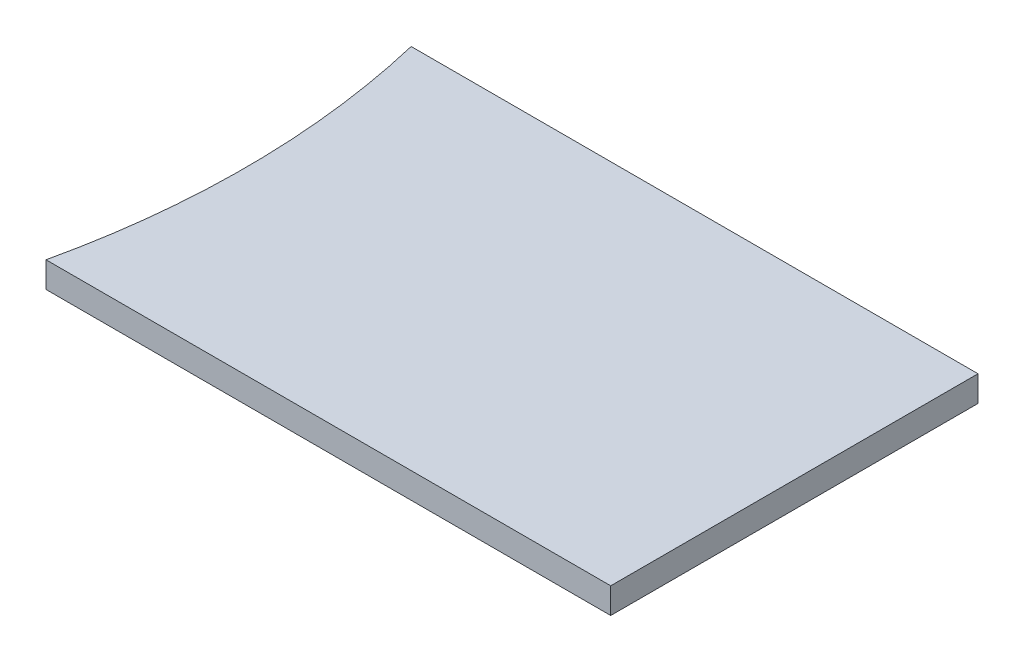
ISO-10303-21;
HEADER;
FILE_DESCRIPTION(('STEP AP214'),'2;1');
FILE_NAME('part.step','',(''),(''),'','','');
FILE_SCHEMA(('AUTOMOTIVE_DESIGN { 1 0 10303 214 1 1 1 1 }'));
ENDSEC;
DATA;
#1=APPLICATION_CONTEXT('core data for automotive mechanical design processes');
#2=APPLICATION_PROTOCOL_DEFINITION('international standard','automotive_design',2000,#1);
#3=PRODUCT_CONTEXT('',#1,'mechanical');
#4=PRODUCT('Part','Part','',(#3));
#5=PRODUCT_RELATED_PRODUCT_CATEGORY('part','',(#4));
#6=PRODUCT_DEFINITION_FORMATION('','',#4);
#7=PRODUCT_DEFINITION_CONTEXT('part definition',#1,'design');
#8=PRODUCT_DEFINITION('design','',#6,#7);
#9=PRODUCT_DEFINITION_SHAPE('','',#8);
#10=(LENGTH_UNIT() NAMED_UNIT(*) SI_UNIT(.MILLI.,.METRE.));
#11=(NAMED_UNIT(*) PLANE_ANGLE_UNIT() SI_UNIT($,.RADIAN.));
#12=(NAMED_UNIT(*) SI_UNIT($,.STERADIAN.) SOLID_ANGLE_UNIT());
#13=UNCERTAINTY_MEASURE_WITH_UNIT(LENGTH_MEASURE(1.E-05),#10,'distance_accuracy_value','');
#14=(GEOMETRIC_REPRESENTATION_CONTEXT(3) GLOBAL_UNCERTAINTY_ASSIGNED_CONTEXT((#13)) GLOBAL_UNIT_ASSIGNED_CONTEXT((#10,
#11,#12)) REPRESENTATION_CONTEXT('',''));
#15=CARTESIAN_POINT('',(0.,0.,0.));
#16=DIRECTION('',(0.,0.,1.));
#17=DIRECTION('',(1.,0.,0.));
#18=AXIS2_PLACEMENT_3D('',#15,#16,#17);
#19=CARTESIAN_POINT('',(0.,1.5,0.));
#20=DIRECTION('',(0.,0.,-1.));
#21=DIRECTION('',(-1.,0.,0.));
#22=AXIS2_PLACEMENT_3D('',#19,#20,#21);
#23=PLANE('',#22);
#24=DIRECTION('',(1.,0.,0.));
#25=VECTOR('',#24,1.);
#26=CARTESIAN_POINT('',(0.,1.5,0.));
#27=LINE('',#26,#25);
#28=CARTESIAN_POINT('',(1.59718808683387,1.5,0.));
#29=VERTEX_POINT('',#28);
#30=CARTESIAN_POINT('',(34.5003802281369,1.5,0.));
#31=VERTEX_POINT('',#30);
#32=EDGE_CURVE('E94',#29,#31,#27,.T.);
#33=ORIENTED_EDGE('',*,*,#32,.F.);
#34=DIRECTION('',(0.,1.,0.));
#35=VECTOR('',#34,1.);
#36=CARTESIAN_POINT('',(1.59718808683387,0.,0.));
#37=LINE('',#36,#35);
#38=CARTESIAN_POINT('',(1.59718808683387,0.,0.));
#39=VERTEX_POINT('',#38);
#40=EDGE_CURVE('E101',#29,#39,#37,.F.);
#41=ORIENTED_EDGE('',*,*,#40,.T.);
#42=DIRECTION('',(1.,0.,0.));
#43=VECTOR('',#42,1.);
#44=CARTESIAN_POINT('',(0.,0.,0.));
#45=LINE('',#44,#43);
#46=CARTESIAN_POINT('',(34.5003802281369,0.,0.));
#47=VERTEX_POINT('',#46);
#48=EDGE_CURVE('E84',#39,#47,#45,.T.);
#49=ORIENTED_EDGE('',*,*,#48,.T.);
#50=DIRECTION('',(0.,-1.,0.));
#51=VECTOR('',#50,1.);
#52=CARTESIAN_POINT('',(34.5003802281369,1.5,0.));
#53=LINE('',#52,#51);
#54=EDGE_CURVE('E11',#31,#47,#53,.T.);
#55=ORIENTED_EDGE('',*,*,#54,.F.);
#56=EDGE_LOOP('',(#33,#41,#49,#55));
#57=FACE_BOUND('',#56,.T.);
#58=ADVANCED_FACE('F38',(#57),#23,.F.);
#59=CARTESIAN_POINT('',(34.5003802281369,1.5,0.));
#60=DIRECTION('',(-1.,0.,0.));
#61=DIRECTION('',(0.,0.,1.));
#62=AXIS2_PLACEMENT_3D('',#59,#60,#61);
#63=PLANE('',#62);
#64=DIRECTION('',(0.,0.,-1.));
#65=VECTOR('',#64,1.);
#66=CARTESIAN_POINT('',(34.5003802281369,0.,0.));
#67=LINE('',#66,#65);
#68=CARTESIAN_POINT('',(34.5003802281369,0.,-21.4));
#69=VERTEX_POINT('',#68);
#70=EDGE_CURVE('E74',#47,#69,#67,.T.);
#71=ORIENTED_EDGE('',*,*,#70,.T.);
#72=DIRECTION('',(0.,-1.,0.));
#73=VECTOR('',#72,1.);
#74=CARTESIAN_POINT('',(34.5003802281369,1.5,-21.4));
#75=LINE('',#74,#73);
#76=CARTESIAN_POINT('',(34.5003802281369,1.5,-21.4));
#77=VERTEX_POINT('',#76);
#78=EDGE_CURVE('E46',#77,#69,#75,.T.);
#79=ORIENTED_EDGE('',*,*,#78,.F.);
#80=DIRECTION('',(0.,0.,-1.));
#81=VECTOR('',#80,1.);
#82=CARTESIAN_POINT('',(34.5003802281369,1.5,0.));
#83=LINE('',#82,#81);
#84=EDGE_CURVE('E62',#31,#77,#83,.T.);
#85=ORIENTED_EDGE('',*,*,#84,.F.);
#86=ORIENTED_EDGE('',*,*,#54,.T.);
#87=EDGE_LOOP('',(#71,#79,#85,#86));
#88=FACE_BOUND('',#87,.T.);
#89=ADVANCED_FACE('F76',(#88),#63,.F.);
#90=CARTESIAN_POINT('',(0.,1.5,-21.4));
#91=DIRECTION('',(0.,0.,1.));
#92=DIRECTION('',(1.,0.,0.));
#93=AXIS2_PLACEMENT_3D('',#90,#91,#92);
#94=PLANE('',#93);
#95=DIRECTION('',(-1.,0.,0.));
#96=VECTOR('',#95,1.);
#97=CARTESIAN_POINT('',(0.,0.,-21.4));
#98=LINE('',#97,#96);
#99=CARTESIAN_POINT('',(1.47362194262295,0.,-21.4));
#100=VERTEX_POINT('',#99);
#101=EDGE_CURVE('E83',#69,#100,#98,.T.);
#102=ORIENTED_EDGE('',*,*,#101,.T.);
#103=DIRECTION('',(0.,1.,0.));
#104=VECTOR('',#103,1.);
#105=CARTESIAN_POINT('',(1.47362194262295,0.,-21.4));
#106=LINE('',#105,#104);
#107=CARTESIAN_POINT('',(1.47362194262295,1.5,-21.4));
#108=VERTEX_POINT('',#107);
#109=EDGE_CURVE('E53',#100,#108,#106,.T.);
#110=ORIENTED_EDGE('',*,*,#109,.T.);
#111=DIRECTION('',(-1.,0.,0.));
#112=VECTOR('',#111,1.);
#113=CARTESIAN_POINT('',(0.,1.5,-21.4));
#114=LINE('',#113,#112);
#115=EDGE_CURVE('E89',#77,#108,#114,.T.);
#116=ORIENTED_EDGE('',*,*,#115,.F.);
#117=ORIENTED_EDGE('',*,*,#78,.T.);
#118=EDGE_LOOP('',(#102,#110,#116,#117));
#119=FACE_BOUND('',#118,.T.);
#120=ADVANCED_FACE('F88',(#119),#94,.F.);
#121=CARTESIAN_POINT('',(0.,1.5,0.));
#122=DIRECTION('',(0.,-1.,0.));
#123=DIRECTION('',(0.,0.,-1.));
#124=AXIS2_PLACEMENT_3D('',#121,#122,#123);
#125=PLANE('',#124);
#126=ORIENTED_EDGE('',*,*,#115,.T.);
#127=CARTESIAN_POINT('',(-44.5376392762,1.5,-10.4339687647155));
#128=DIRECTION('',(0.,1.,0.));
#129=DIRECTION('',(0.,0.,1.));
#130=AXIS2_PLACEMENT_3D('',#127,#128,#129);
#131=CIRCLE('',#130,47.3);
#132=EDGE_CURVE('E111',#29,#108,#131,.T.);
#133=ORIENTED_EDGE('',*,*,#132,.F.);
#134=ORIENTED_EDGE('',*,*,#32,.T.);
#135=ORIENTED_EDGE('',*,*,#84,.T.);
#136=EDGE_LOOP('',(#126,#133,#134,#135));
#137=FACE_BOUND('',#136,.T.);
#138=ADVANCED_FACE('F120',(#137),#125,.F.);
#139=CARTESIAN_POINT('',(0.,0.,0.));
#140=DIRECTION('',(0.,-1.,0.));
#141=DIRECTION('',(0.,0.,-1.));
#142=AXIS2_PLACEMENT_3D('',#139,#140,#141);
#143=PLANE('',#142);
#144=CARTESIAN_POINT('',(-44.5376392762,0.,-10.4339687647155));
#145=DIRECTION('',(0.,1.,0.));
#146=DIRECTION('',(0.,0.,1.));
#147=AXIS2_PLACEMENT_3D('',#144,#145,#146);
#148=CIRCLE('',#147,47.3);
#149=EDGE_CURVE('E92',#39,#100,#148,.T.);
#150=ORIENTED_EDGE('',*,*,#149,.T.);
#151=ORIENTED_EDGE('',*,*,#101,.F.);
#152=ORIENTED_EDGE('',*,*,#70,.F.);
#153=ORIENTED_EDGE('',*,*,#48,.F.);
#154=EDGE_LOOP('',(#150,#151,#152,#153));
#155=FACE_BOUND('',#154,.T.);
#156=ADVANCED_FACE('F91',(#155),#143,.T.);
#157=CARTESIAN_POINT('',(-44.5376392762,0.,-10.4339687647155));
#158=DIRECTION('',(0.,1.,0.));
#159=DIRECTION('',(0.,0.,1.));
#160=AXIS2_PLACEMENT_3D('',#157,#158,#159);
#161=CYLINDRICAL_SURFACE('',#160,47.3);
#162=ORIENTED_EDGE('',*,*,#132,.T.);
#163=ORIENTED_EDGE('',*,*,#109,.F.);
#164=ORIENTED_EDGE('',*,*,#149,.F.);
#165=ORIENTED_EDGE('',*,*,#40,.F.);
#166=EDGE_LOOP('',(#162,#163,#164,#165));
#167=FACE_BOUND('',#166,.T.);
#168=ADVANCED_FACE('F117',(#167),#161,.F.);
#169=CLOSED_SHELL('',(#58,#89,#120,#138,#156,#168));
#170=MANIFOLD_SOLID_BREP('B2',#169);
#171=ADVANCED_BREP_SHAPE_REPRESENTATION('',(#18,#170),#14);
#172=SHAPE_DEFINITION_REPRESENTATION(#9,#171);
ENDSEC;
END-ISO-10303-21;
